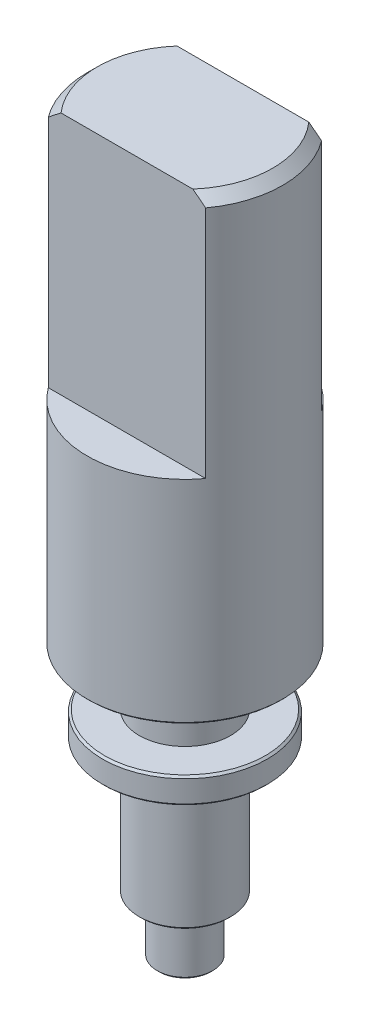
ISO-10303-21;
HEADER;
FILE_DESCRIPTION(('STEP AP214'),'2;1');
FILE_NAME('part.step','',(''),(''),'','','');
FILE_SCHEMA(('AUTOMOTIVE_DESIGN { 1 0 10303 214 1 1 1 1 }'));
ENDSEC;
DATA;
#1=APPLICATION_CONTEXT('core data for automotive mechanical design processes');
#2=APPLICATION_PROTOCOL_DEFINITION('international standard','automotive_design',2000,#1);
#3=PRODUCT_CONTEXT('',#1,'mechanical');
#4=PRODUCT('Part','Part','',(#3));
#5=PRODUCT_RELATED_PRODUCT_CATEGORY('part','',(#4));
#6=PRODUCT_DEFINITION_FORMATION('','',#4);
#7=PRODUCT_DEFINITION_CONTEXT('part definition',#1,'design');
#8=PRODUCT_DEFINITION('design','',#6,#7);
#9=PRODUCT_DEFINITION_SHAPE('','',#8);
#10=(LENGTH_UNIT() NAMED_UNIT(*) SI_UNIT(.MILLI.,.METRE.));
#11=(NAMED_UNIT(*) PLANE_ANGLE_UNIT() SI_UNIT($,.RADIAN.));
#12=(NAMED_UNIT(*) SI_UNIT($,.STERADIAN.) SOLID_ANGLE_UNIT());
#13=UNCERTAINTY_MEASURE_WITH_UNIT(LENGTH_MEASURE(1.E-05),#10,'distance_accuracy_value','');
#14=(GEOMETRIC_REPRESENTATION_CONTEXT(3) GLOBAL_UNCERTAINTY_ASSIGNED_CONTEXT((#13)) GLOBAL_UNIT_ASSIGNED_CONTEXT((#10,
#11,#12)) REPRESENTATION_CONTEXT('',''));
#15=CARTESIAN_POINT('',(0.,0.,0.));
#16=DIRECTION('',(0.,0.,1.));
#17=DIRECTION('',(1.,0.,0.));
#18=AXIS2_PLACEMENT_3D('',#15,#16,#17);
#19=CARTESIAN_POINT('',(-2.46,18.3,0.));
#20=DIRECTION('',(0.,1.,0.));
#21=DIRECTION('',(0.,0.,1.));
#22=AXIS2_PLACEMENT_3D('',#19,#20,#21);
#23=PLANE('',#22);
#24=DIRECTION('',(1.,0.,0.));
#25=VECTOR('',#24,1.);
#26=CARTESIAN_POINT('',(-1.97989898732233,18.3,-1.46));
#27=LINE('',#26,#25);
#28=CARTESIAN_POINT('',(-1.65906600230371,18.3,-1.46));
#29=VERTEX_POINT('',#28);
#30=CARTESIAN_POINT('',(1.65906600230371,18.3,-1.46));
#31=VERTEX_POINT('',#30);
#32=EDGE_CURVE('E96',#29,#31,#27,.T.);
#33=ORIENTED_EDGE('',*,*,#32,.F.);
#34=CARTESIAN_POINT('',(0.,18.3,0.));
#35=DIRECTION('',(0.,1.,0.));
#36=DIRECTION('',(0.,0.,1.));
#37=AXIS2_PLACEMENT_3D('',#34,#35,#36);
#38=CIRCLE('',#37,2.21);
#39=CARTESIAN_POINT('',(-1.65906600230371,18.3,1.46));
#40=VERTEX_POINT('',#39);
#41=EDGE_CURVE('E135',#29,#40,#38,.T.);
#42=ORIENTED_EDGE('',*,*,#41,.T.);
#43=DIRECTION('',(-1.,0.,0.));
#44=VECTOR('',#43,1.);
#45=CARTESIAN_POINT('',(-1.97989898732233,18.3,1.46));
#46=LINE('',#45,#44);
#47=CARTESIAN_POINT('',(1.65906600230371,18.3,1.46));
#48=VERTEX_POINT('',#47);
#49=EDGE_CURVE('E105',#48,#40,#46,.T.);
#50=ORIENTED_EDGE('',*,*,#49,.F.);
#51=CARTESIAN_POINT('',(0.,18.3,0.));
#52=DIRECTION('',(0.,1.,0.));
#53=DIRECTION('',(0.,0.,1.));
#54=AXIS2_PLACEMENT_3D('',#51,#52,#53);
#55=CIRCLE('',#54,2.21);
#56=EDGE_CURVE('E132',#48,#31,#55,.T.);
#57=ORIENTED_EDGE('',*,*,#56,.T.);
#58=EDGE_LOOP('',(#33,#42,#50,#57));
#59=FACE_BOUND('',#58,.T.);
#60=ADVANCED_FACE('F37',(#59),#23,.T.);
#61=CARTESIAN_POINT('',(0.,0.,0.));
#62=DIRECTION('',(0.,-1.,0.));
#63=DIRECTION('',(0.,0.,-1.));
#64=AXIS2_PLACEMENT_3D('',#61,#62,#63);
#65=PLANE('',#64);
#66=CARTESIAN_POINT('',(0.,0.,0.));
#67=DIRECTION('',(0.,-1.,0.));
#68=DIRECTION('',(0.,0.,-1.));
#69=AXIS2_PLACEMENT_3D('',#66,#67,#68);
#70=CIRCLE('',#69,0.649999999999996);
#71=CARTESIAN_POINT('',(0.,0.,-0.649999999999996));
#72=VERTEX_POINT('',#71);
#73=EDGE_CURVE('E11',#72,#72,#70,.T.);
#74=ORIENTED_EDGE('',*,*,#73,.T.);
#75=EDGE_LOOP('',(#74));
#76=FACE_BOUND('',#75,.T.);
#77=ADVANCED_FACE('F197',(#76),#65,.T.);
#78=CARTESIAN_POINT('',(0.,18.3,0.));
#79=DIRECTION('',(0.,1.,0.));
#80=DIRECTION('',(0.,0.,1.));
#81=AXIS2_PLACEMENT_3D('',#78,#79,#80);
#82=CYLINDRICAL_SURFACE('',#81,0.699999999999998);
#83=CARTESIAN_POINT('',(0.,0.0500000000000014,0.));
#84=DIRECTION('',(0.,-1.,0.));
#85=DIRECTION('',(0.,0.,-1.));
#86=AXIS2_PLACEMENT_3D('',#83,#84,#85);
#87=CIRCLE('',#86,0.699999999999998);
#88=CARTESIAN_POINT('',(0.,0.0500000000000014,-0.699999999999998));
#89=VERTEX_POINT('',#88);
#90=EDGE_CURVE('E45',#89,#89,#87,.F.);
#91=ORIENTED_EDGE('',*,*,#90,.T.);
#92=EDGE_LOOP('',(#91));
#93=FACE_BOUND('',#92,.T.);
#94=CARTESIAN_POINT('',(0.,1.4,0.));
#95=DIRECTION('',(0.,1.,0.));
#96=DIRECTION('',(0.,0.,1.));
#97=AXIS2_PLACEMENT_3D('',#94,#95,#96);
#98=CIRCLE('',#97,0.699999999999998);
#99=CARTESIAN_POINT('',(0.,1.4,0.699999999999998));
#100=VERTEX_POINT('',#99);
#101=EDGE_CURVE('E129',#100,#100,#98,.T.);
#102=ORIENTED_EDGE('',*,*,#101,.F.);
#103=EDGE_LOOP('',(#102));
#104=FACE_BOUND('',#103,.T.);
#105=ADVANCED_FACE('F193',(#93,#104),#82,.T.);
#106=CARTESIAN_POINT('',(-0.699999999999998,1.4,0.));
#107=DIRECTION('',(0.,-1.,0.));
#108=DIRECTION('',(0.,0.,-1.));
#109=AXIS2_PLACEMENT_3D('',#106,#107,#108);
#110=PLANE('',#109);
#111=CARTESIAN_POINT('',(0.,1.4,0.));
#112=DIRECTION('',(0.,-1.,0.));
#113=DIRECTION('',(0.,0.,-1.));
#114=AXIS2_PLACEMENT_3D('',#111,#112,#113);
#115=CIRCLE('',#114,1.1);
#116=CARTESIAN_POINT('',(0.,1.4,-1.1));
#117=VERTEX_POINT('',#116);
#118=EDGE_CURVE('E407',#117,#117,#115,.T.);
#119=ORIENTED_EDGE('',*,*,#118,.T.);
#120=EDGE_LOOP('',(#119));
#121=FACE_BOUND('',#120,.T.);
#122=ORIENTED_EDGE('',*,*,#101,.T.);
#123=EDGE_LOOP('',(#122));
#124=FACE_BOUND('',#123,.T.);
#125=ADVANCED_FACE('F189',(#121,#124),#110,.T.);
#126=CARTESIAN_POINT('',(0.,18.3,0.));
#127=DIRECTION('',(0.,1.,0.));
#128=DIRECTION('',(0.,0.,1.));
#129=AXIS2_PLACEMENT_3D('',#126,#127,#128);
#130=CYLINDRICAL_SURFACE('',#129,1.15);
#131=CARTESIAN_POINT('',(0.,1.45,0.));
#132=DIRECTION('',(0.,-1.,0.));
#133=DIRECTION('',(0.,0.,-1.));
#134=AXIS2_PLACEMENT_3D('',#131,#132,#133);
#135=CIRCLE('',#134,1.15);
#136=CARTESIAN_POINT('',(0.,1.45,-1.15));
#137=VERTEX_POINT('',#136);
#138=EDGE_CURVE('E410',#137,#137,#135,.F.);
#139=ORIENTED_EDGE('',*,*,#138,.T.);
#140=EDGE_LOOP('',(#139));
#141=FACE_BOUND('',#140,.T.);
#142=CARTESIAN_POINT('',(0.,4.75,0.));
#143=DIRECTION('',(0.,1.,0.));
#144=DIRECTION('',(0.,0.,1.));
#145=AXIS2_PLACEMENT_3D('',#142,#143,#144);
#146=CIRCLE('',#145,1.15);
#147=CARTESIAN_POINT('',(0.,4.75,1.15));
#148=VERTEX_POINT('',#147);
#149=EDGE_CURVE('E126',#148,#148,#146,.T.);
#150=ORIENTED_EDGE('',*,*,#149,.F.);
#151=EDGE_LOOP('',(#150));
#152=FACE_BOUND('',#151,.T.);
#153=ADVANCED_FACE('F185',(#141,#152),#130,.T.);
#154=CARTESIAN_POINT('',(-1.15,4.75,0.));
#155=DIRECTION('',(0.,-1.,0.));
#156=DIRECTION('',(0.,0.,-1.));
#157=AXIS2_PLACEMENT_3D('',#154,#155,#156);
#158=PLANE('',#157);
#159=CARTESIAN_POINT('',(0.,4.75,0.));
#160=DIRECTION('',(0.,-1.,0.));
#161=DIRECTION('',(0.,0.,-1.));
#162=AXIS2_PLACEMENT_3D('',#159,#160,#161);
#163=CIRCLE('',#162,2.025);
#164=CARTESIAN_POINT('',(0.,4.75,-2.025));
#165=VERTEX_POINT('',#164);
#166=EDGE_CURVE('E394',#165,#165,#163,.T.);
#167=ORIENTED_EDGE('',*,*,#166,.T.);
#168=EDGE_LOOP('',(#167));
#169=FACE_BOUND('',#168,.T.);
#170=ORIENTED_EDGE('',*,*,#149,.T.);
#171=EDGE_LOOP('',(#170));
#172=FACE_BOUND('',#171,.T.);
#173=ADVANCED_FACE('F181',(#169,#172),#158,.T.);
#174=CARTESIAN_POINT('',(0.,18.3,0.));
#175=DIRECTION('',(0.,1.,0.));
#176=DIRECTION('',(0.,0.,1.));
#177=AXIS2_PLACEMENT_3D('',#174,#175,#176);
#178=CYLINDRICAL_SURFACE('',#177,2.075);
#179=CARTESIAN_POINT('',(0.,5.35,0.));
#180=DIRECTION('',(0.,1.,0.));
#181=DIRECTION('',(0.,0.,1.));
#182=AXIS2_PLACEMENT_3D('',#179,#180,#181);
#183=CIRCLE('',#182,2.075);
#184=CARTESIAN_POINT('',(0.,5.35,2.075));
#185=VERTEX_POINT('',#184);
#186=EDGE_CURVE('E396',#185,#185,#183,.F.);
#187=ORIENTED_EDGE('',*,*,#186,.T.);
#188=EDGE_LOOP('',(#187));
#189=FACE_BOUND('',#188,.T.);
#190=CARTESIAN_POINT('',(0.,4.8,0.));
#191=DIRECTION('',(0.,-1.,0.));
#192=DIRECTION('',(0.,0.,-1.));
#193=AXIS2_PLACEMENT_3D('',#190,#191,#192);
#194=CIRCLE('',#193,2.075);
#195=CARTESIAN_POINT('',(0.,4.8,-2.075));
#196=VERTEX_POINT('',#195);
#197=EDGE_CURVE('E401',#196,#196,#194,.F.);
#198=ORIENTED_EDGE('',*,*,#197,.T.);
#199=EDGE_LOOP('',(#198));
#200=FACE_BOUND('',#199,.T.);
#201=ADVANCED_FACE('F177',(#189,#200),#178,.T.);
#202=CARTESIAN_POINT('',(-2.075,5.4,0.));
#203=DIRECTION('',(0.,1.,0.));
#204=DIRECTION('',(0.,0.,1.));
#205=AXIS2_PLACEMENT_3D('',#202,#203,#204);
#206=PLANE('',#205);
#207=CARTESIAN_POINT('',(0.,5.4,0.));
#208=DIRECTION('',(0.,1.,0.));
#209=DIRECTION('',(0.,0.,1.));
#210=AXIS2_PLACEMENT_3D('',#207,#208,#209);
#211=CIRCLE('',#210,2.025);
#212=CARTESIAN_POINT('',(0.,5.4,2.025));
#213=VERTEX_POINT('',#212);
#214=EDGE_CURVE('E404',#213,#213,#211,.T.);
#215=ORIENTED_EDGE('',*,*,#214,.T.);
#216=EDGE_LOOP('',(#215));
#217=FACE_BOUND('',#216,.T.);
#218=CARTESIAN_POINT('',(0.,5.4,0.));
#219=DIRECTION('',(0.,1.,0.));
#220=DIRECTION('',(0.,0.,1.));
#221=AXIS2_PLACEMENT_3D('',#218,#219,#220);
#222=CIRCLE('',#221,1.15);
#223=CARTESIAN_POINT('',(0.,5.4,1.15));
#224=VERTEX_POINT('',#223);
#225=EDGE_CURVE('E123',#224,#224,#222,.T.);
#226=ORIENTED_EDGE('',*,*,#225,.F.);
#227=EDGE_LOOP('',(#226));
#228=FACE_BOUND('',#227,.T.);
#229=ADVANCED_FACE('F173',(#217,#228),#206,.T.);
#230=CARTESIAN_POINT('',(0.,18.3,0.));
#231=DIRECTION('',(0.,1.,0.));
#232=DIRECTION('',(0.,0.,1.));
#233=AXIS2_PLACEMENT_3D('',#230,#231,#232);
#234=CYLINDRICAL_SURFACE('',#233,1.15);
#235=ORIENTED_EDGE('',*,*,#225,.T.);
#236=EDGE_LOOP('',(#235));
#237=FACE_BOUND('',#236,.T.);
#238=CARTESIAN_POINT('',(0.,6.8,0.));
#239=DIRECTION('',(0.,1.,0.));
#240=DIRECTION('',(0.,0.,1.));
#241=AXIS2_PLACEMENT_3D('',#238,#239,#240);
#242=CIRCLE('',#241,1.15);
#243=CARTESIAN_POINT('',(0.,6.8,1.15));
#244=VERTEX_POINT('',#243);
#245=EDGE_CURVE('E118',#244,#244,#242,.T.);
#246=ORIENTED_EDGE('',*,*,#245,.F.);
#247=EDGE_LOOP('',(#246));
#248=FACE_BOUND('',#247,.T.);
#249=ADVANCED_FACE('F169',(#237,#248),#234,.T.);
#250=CARTESIAN_POINT('',(-1.15,6.8,0.));
#251=DIRECTION('',(0.,-1.,0.));
#252=DIRECTION('',(0.,0.,-1.));
#253=AXIS2_PLACEMENT_3D('',#250,#251,#252);
#254=PLANE('',#253);
#255=CARTESIAN_POINT('',(0.,6.8,0.));
#256=DIRECTION('',(0.,-1.,0.));
#257=DIRECTION('',(0.,0.,-1.));
#258=AXIS2_PLACEMENT_3D('',#255,#256,#257);
#259=CIRCLE('',#258,2.40999999999999);
#260=CARTESIAN_POINT('',(0.,6.8,-2.40999999999999));
#261=VERTEX_POINT('',#260);
#262=EDGE_CURVE('E412',#261,#261,#259,.T.);
#263=ORIENTED_EDGE('',*,*,#262,.T.);
#264=EDGE_LOOP('',(#263));
#265=FACE_BOUND('',#264,.T.);
#266=ORIENTED_EDGE('',*,*,#245,.T.);
#267=EDGE_LOOP('',(#266));
#268=FACE_BOUND('',#267,.T.);
#269=ADVANCED_FACE('F165',(#265,#268),#254,.T.);
#270=CARTESIAN_POINT('',(0.,18.3,0.));
#271=DIRECTION('',(0.,1.,0.));
#272=DIRECTION('',(0.,0.,1.));
#273=AXIS2_PLACEMENT_3D('',#270,#271,#272);
#274=CYLINDRICAL_SURFACE('',#273,2.46);
#275=CARTESIAN_POINT('',(0.,6.85,0.));
#276=DIRECTION('',(0.,-1.,0.));
#277=DIRECTION('',(0.,0.,-1.));
#278=AXIS2_PLACEMENT_3D('',#275,#276,#277);
#279=CIRCLE('',#278,2.46);
#280=CARTESIAN_POINT('',(0.,6.85,-2.46));
#281=VERTEX_POINT('',#280);
#282=EDGE_CURVE('E216',#281,#281,#279,.F.);
#283=ORIENTED_EDGE('',*,*,#282,.T.);
#284=EDGE_LOOP('',(#283));
#285=FACE_BOUND('',#284,.T.);
#286=DIRECTION('',(0.,1.,0.));
#287=VECTOR('',#286,1.);
#288=CARTESIAN_POINT('',(-1.97989898732233,12.15,1.46));
#289=LINE('',#288,#287);
#290=CARTESIAN_POINT('',(-1.97989898732233,12.15,1.46));
#291=VERTEX_POINT('',#290);
#292=CARTESIAN_POINT('',(-1.97989898732233,18.05,1.46));
#293=VERTEX_POINT('',#292);
#294=EDGE_CURVE('E116',#291,#293,#289,.T.);
#295=ORIENTED_EDGE('',*,*,#294,.T.);
#296=CARTESIAN_POINT('',(0.,18.05,0.));
#297=DIRECTION('',(0.,1.,0.));
#298=DIRECTION('',(0.,0.,1.));
#299=AXIS2_PLACEMENT_3D('',#296,#297,#298);
#300=CIRCLE('',#299,2.46);
#301=CARTESIAN_POINT('',(-1.97989898732233,18.05,-1.46));
#302=VERTEX_POINT('',#301);
#303=EDGE_CURVE('E52',#293,#302,#300,.F.);
#304=ORIENTED_EDGE('',*,*,#303,.T.);
#305=DIRECTION('',(0.,1.,0.));
#306=VECTOR('',#305,1.);
#307=CARTESIAN_POINT('',(-1.97989898732233,12.15,-1.46));
#308=LINE('',#307,#306);
#309=CARTESIAN_POINT('',(-1.97989898732233,12.15,-1.46));
#310=VERTEX_POINT('',#309);
#311=EDGE_CURVE('E99',#310,#302,#308,.T.);
#312=ORIENTED_EDGE('',*,*,#311,.F.);
#313=CARTESIAN_POINT('',(0.,12.15,0.));
#314=DIRECTION('',(0.,1.,0.));
#315=DIRECTION('',(0.,0.,1.));
#316=AXIS2_PLACEMENT_3D('',#313,#314,#315);
#317=CIRCLE('',#316,2.46);
#318=CARTESIAN_POINT('',(1.97989898732233,12.15,-1.46));
#319=VERTEX_POINT('',#318);
#320=EDGE_CURVE('E92',#319,#310,#317,.T.);
#321=ORIENTED_EDGE('',*,*,#320,.F.);
#322=DIRECTION('',(0.,1.,0.));
#323=VECTOR('',#322,1.);
#324=CARTESIAN_POINT('',(1.97989898732233,12.15,-1.46));
#325=LINE('',#324,#323);
#326=CARTESIAN_POINT('',(1.97989898732233,18.05,-1.46));
#327=VERTEX_POINT('',#326);
#328=EDGE_CURVE('E101',#319,#327,#325,.T.);
#329=ORIENTED_EDGE('',*,*,#328,.T.);
#330=CARTESIAN_POINT('',(0.,18.05,0.));
#331=DIRECTION('',(0.,1.,0.));
#332=DIRECTION('',(0.,0.,1.));
#333=AXIS2_PLACEMENT_3D('',#330,#331,#332);
#334=CIRCLE('',#333,2.46);
#335=CARTESIAN_POINT('',(1.97989898732233,18.05,1.46));
#336=VERTEX_POINT('',#335);
#337=EDGE_CURVE('E385',#327,#336,#334,.F.);
#338=ORIENTED_EDGE('',*,*,#337,.T.);
#339=DIRECTION('',(0.,1.,0.));
#340=VECTOR('',#339,1.);
#341=CARTESIAN_POINT('',(1.97989898732233,12.15,1.46));
#342=LINE('',#341,#340);
#343=CARTESIAN_POINT('',(1.97989898732233,12.15,1.46));
#344=VERTEX_POINT('',#343);
#345=EDGE_CURVE('E113',#344,#336,#342,.T.);
#346=ORIENTED_EDGE('',*,*,#345,.F.);
#347=CARTESIAN_POINT('',(0.,12.15,0.));
#348=DIRECTION('',(0.,1.,0.));
#349=DIRECTION('',(0.,0.,1.));
#350=AXIS2_PLACEMENT_3D('',#347,#348,#349);
#351=CIRCLE('',#350,2.46);
#352=EDGE_CURVE('E109',#291,#344,#351,.T.);
#353=ORIENTED_EDGE('',*,*,#352,.F.);
#354=EDGE_LOOP('',(#295,#304,#312,#321,#329,#338,#346,#353));
#355=FACE_BOUND('',#354,.T.);
#356=ADVANCED_FACE('F103',(#285,#355),#274,.T.);
#357=CARTESIAN_POINT('',(-1.97989898732233,12.15,1.46));
#358=DIRECTION('',(0.,0.,-1.));
#359=DIRECTION('',(-1.,0.,0.));
#360=AXIS2_PLACEMENT_3D('',#357,#358,#359);
#361=PLANE('',#360);
#362=ORIENTED_EDGE('',*,*,#49,.T.);
#363=CARTESIAN_POINT('',(-1.65906600230371,18.3,1.46));
#364=CARTESIAN_POINT('',(-1.68617458978429,18.2796484395284,1.46));
#365=CARTESIAN_POINT('',(-1.71317928404995,18.2591590177984,1.46));
#366=CARTESIAN_POINT('',(-1.76699585580801,18.217932332114,1.46));
#367=CARTESIAN_POINT('',(-1.79380774678302,18.1971950857651,1.46));
#368=CARTESIAN_POINT('',(-1.84725720985176,18.1554979799921,1.46));
#369=CARTESIAN_POINT('',(-1.87389478387278,18.134538123036,1.46));
#370=CARTESIAN_POINT('',(-1.92701213315352,18.0924155188503,1.46));
#371=CARTESIAN_POINT('',(-1.95349189714086,18.0712527574024,1.46));
#372=CARTESIAN_POINT('',(-1.97989898732235,18.05,1.46));
#373=B_SPLINE_CURVE_WITH_KNOTS('',3,(#363,#364,#365,#366,#367,#368,#369,#370,#371,#372),
.UNSPECIFIED.,.F.,.F.,(4,2,2,2,4),(0.,0.101692536253413,0.203377890674927,0.305062118932271,
0.406753525481858),.UNSPECIFIED.);
#374=EDGE_CURVE('E145',#40,#293,#373,.T.);
#375=ORIENTED_EDGE('',*,*,#374,.T.);
#376=ORIENTED_EDGE('',*,*,#294,.F.);
#377=DIRECTION('',(-1.,0.,0.));
#378=VECTOR('',#377,1.);
#379=CARTESIAN_POINT('',(-1.97989898732233,12.15,1.46));
#380=LINE('',#379,#378);
#381=EDGE_CURVE('E111',#344,#291,#380,.T.);
#382=ORIENTED_EDGE('',*,*,#381,.F.);
#383=ORIENTED_EDGE('',*,*,#345,.T.);
#384=CARTESIAN_POINT('',(1.97989898732233,18.05,1.46));
#385=CARTESIAN_POINT('',(1.95349189714085,18.0712527574024,1.46));
#386=CARTESIAN_POINT('',(1.92701213315352,18.0924155188503,1.46));
#387=CARTESIAN_POINT('',(1.87389478387278,18.134538123036,1.46));
#388=CARTESIAN_POINT('',(1.84725720985176,18.1554979799921,1.46));
#389=CARTESIAN_POINT('',(1.79380774678302,18.1971950857651,1.46));
#390=CARTESIAN_POINT('',(1.76699585580801,18.2179323321139,1.46));
#391=CARTESIAN_POINT('',(1.71317928404995,18.2591590177984,1.46));
#392=CARTESIAN_POINT('',(1.6861745897843,18.2796484395284,1.46));
#393=CARTESIAN_POINT('',(1.65906600230374,18.3,1.46));
#394=B_SPLINE_CURVE_WITH_KNOTS('',3,(#384,#385,#386,#387,#388,#389,#390,#391,#392,#393),
.UNSPECIFIED.,.F.,.F.,(4,2,2,2,4),(0.,0.101691406549585,0.203375634806927,0.305060989228441,
0.406753525481854),.UNSPECIFIED.);
#395=EDGE_CURVE('E138',#336,#48,#394,.T.);
#396=ORIENTED_EDGE('',*,*,#395,.T.);
#397=EDGE_LOOP('',(#362,#375,#376,#382,#383,#396));
#398=FACE_BOUND('',#397,.T.);
#399=ADVANCED_FACE('F154',(#398),#361,.F.);
#400=CARTESIAN_POINT('',(0.,12.15,0.));
#401=DIRECTION('',(0.,1.,0.));
#402=DIRECTION('',(0.,0.,1.));
#403=AXIS2_PLACEMENT_3D('',#400,#401,#402);
#404=PLANE('',#403);
#405=ORIENTED_EDGE('',*,*,#352,.T.);
#406=ORIENTED_EDGE('',*,*,#381,.T.);
#407=EDGE_LOOP('',(#405,#406));
#408=FACE_BOUND('',#407,.T.);
#409=ADVANCED_FACE('F159',(#408),#404,.T.);
#410=CARTESIAN_POINT('',(-1.97989898732233,12.15,-1.46));
#411=DIRECTION('',(0.,0.,1.));
#412=DIRECTION('',(1.,0.,0.));
#413=AXIS2_PLACEMENT_3D('',#410,#411,#412);
#414=PLANE('',#413);
#415=ORIENTED_EDGE('',*,*,#311,.T.);
#416=CARTESIAN_POINT('',(-1.97989898732233,18.05,-1.46));
#417=CARTESIAN_POINT('',(-1.95349189714085,18.0712527574024,-1.46));
#418=CARTESIAN_POINT('',(-1.92701213315352,18.0924155188503,-1.46));
#419=CARTESIAN_POINT('',(-1.87389478387278,18.134538123036,-1.46));
#420=CARTESIAN_POINT('',(-1.84725720985176,18.1554979799921,-1.46));
#421=CARTESIAN_POINT('',(-1.79380774678302,18.1971950857651,-1.46));
#422=CARTESIAN_POINT('',(-1.76699585580801,18.2179323321139,-1.46));
#423=CARTESIAN_POINT('',(-1.71317928404996,18.2591590177984,-1.46));
#424=CARTESIAN_POINT('',(-1.6861745897843,18.2796484395284,-1.46));
#425=CARTESIAN_POINT('',(-1.65906600230374,18.3,-1.46));
#426=B_SPLINE_CURVE_WITH_KNOTS('',3,(#416,#417,#418,#419,#420,#421,#422,#423,#424,#425),
.UNSPECIFIED.,.F.,.F.,(4,2,2,2,4),(0.,0.101691406549585,0.203375634806927,0.305060989228437,
0.406753525481854),.UNSPECIFIED.);
#427=EDGE_CURVE('E210',#302,#29,#426,.T.);
#428=ORIENTED_EDGE('',*,*,#427,.T.);
#429=ORIENTED_EDGE('',*,*,#32,.T.);
#430=CARTESIAN_POINT('',(1.65906600230371,18.3,-1.46));
#431=CARTESIAN_POINT('',(1.68617458978429,18.2796484395284,-1.46));
#432=CARTESIAN_POINT('',(1.71317928404995,18.2591590177984,-1.46));
#433=CARTESIAN_POINT('',(1.76699585580801,18.217932332114,-1.46));
#434=CARTESIAN_POINT('',(1.79380774678302,18.1971950857651,-1.46));
#435=CARTESIAN_POINT('',(1.84725720985176,18.1554979799921,-1.46));
#436=CARTESIAN_POINT('',(1.87389478387278,18.134538123036,-1.46));
#437=CARTESIAN_POINT('',(1.92701213315352,18.0924155188503,-1.46));
#438=CARTESIAN_POINT('',(1.95349189714086,18.0712527574024,-1.46));
#439=CARTESIAN_POINT('',(1.97989898732235,18.05,-1.46));
#440=B_SPLINE_CURVE_WITH_KNOTS('',3,(#430,#431,#432,#433,#434,#435,#436,#437,#438,#439),
.UNSPECIFIED.,.F.,.F.,(4,2,2,2,4),(0.,0.101692536253413,0.203377890674927,0.305062118932271,
0.406753525481858),.UNSPECIFIED.);
#441=EDGE_CURVE('E60',#31,#327,#440,.T.);
#442=ORIENTED_EDGE('',*,*,#441,.T.);
#443=ORIENTED_EDGE('',*,*,#328,.F.);
#444=DIRECTION('',(1.,0.,0.));
#445=VECTOR('',#444,1.);
#446=CARTESIAN_POINT('',(-1.97989898732233,12.15,-1.46));
#447=LINE('',#446,#445);
#448=EDGE_CURVE('E95',#310,#319,#447,.T.);
#449=ORIENTED_EDGE('',*,*,#448,.F.);
#450=EDGE_LOOP('',(#415,#428,#429,#442,#443,#449));
#451=FACE_BOUND('',#450,.T.);
#452=ADVANCED_FACE('F98',(#451),#414,.F.);
#453=CARTESIAN_POINT('',(0.,12.15,0.));
#454=DIRECTION('',(0.,1.,0.));
#455=DIRECTION('',(0.,0.,1.));
#456=AXIS2_PLACEMENT_3D('',#453,#454,#455);
#457=PLANE('',#456);
#458=ORIENTED_EDGE('',*,*,#320,.T.);
#459=ORIENTED_EDGE('',*,*,#448,.T.);
#460=EDGE_LOOP('',(#458,#459));
#461=FACE_BOUND('',#460,.T.);
#462=ADVANCED_FACE('F94',(#461),#457,.T.);
#463=CARTESIAN_POINT('',(0.,18.3,0.));
#464=DIRECTION('',(0.,-1.,0.));
#465=DIRECTION('',(0.,0.,-1.));
#466=AXIS2_PLACEMENT_3D('',#463,#464,#465);
#467=CONICAL_SURFACE('',#466,2.21,0.785398163397447);
#468=ORIENTED_EDGE('',*,*,#427,.F.);
#469=ORIENTED_EDGE('',*,*,#303,.F.);
#470=ORIENTED_EDGE('',*,*,#374,.F.);
#471=ORIENTED_EDGE('',*,*,#41,.F.);
#472=EDGE_LOOP('',(#468,#469,#470,#471));
#473=FACE_BOUND('',#472,.T.);
#474=ADVANCED_FACE('F204',(#473),#467,.T.);
#475=CARTESIAN_POINT('',(0.,18.3,0.));
#476=DIRECTION('',(0.,-1.,0.));
#477=DIRECTION('',(0.,0.,-1.));
#478=AXIS2_PLACEMENT_3D('',#475,#476,#477);
#479=CONICAL_SURFACE('',#478,2.21,0.785398163397447);
#480=ORIENTED_EDGE('',*,*,#395,.F.);
#481=ORIENTED_EDGE('',*,*,#337,.F.);
#482=ORIENTED_EDGE('',*,*,#441,.F.);
#483=ORIENTED_EDGE('',*,*,#56,.F.);
#484=EDGE_LOOP('',(#480,#481,#482,#483));
#485=FACE_BOUND('',#484,.T.);
#486=ADVANCED_FACE('F151',(#485),#479,.T.);
#487=CARTESIAN_POINT('',(0.,6.85,0.));
#488=DIRECTION('',(0.,1.,0.));
#489=DIRECTION('',(0.,0.,1.));
#490=AXIS2_PLACEMENT_3D('',#487,#488,#489);
#491=CONICAL_SURFACE('',#490,2.46,0.785398163397461);
#492=ORIENTED_EDGE('',*,*,#262,.F.);
#493=EDGE_LOOP('',(#492));
#494=FACE_BOUND('',#493,.T.);
#495=ORIENTED_EDGE('',*,*,#282,.F.);
#496=EDGE_LOOP('',(#495));
#497=FACE_BOUND('',#496,.T.);
#498=ADVANCED_FACE('F244',(#494,#497),#491,.T.);
#499=CARTESIAN_POINT('',(0.,1.45,0.));
#500=DIRECTION('',(0.,1.,0.));
#501=DIRECTION('',(0.,0.,1.));
#502=AXIS2_PLACEMENT_3D('',#499,#500,#501);
#503=CONICAL_SURFACE('',#502,1.15,0.785398163397409);
#504=ORIENTED_EDGE('',*,*,#118,.F.);
#505=EDGE_LOOP('',(#504));
#506=FACE_BOUND('',#505,.T.);
#507=ORIENTED_EDGE('',*,*,#138,.F.);
#508=EDGE_LOOP('',(#507));
#509=FACE_BOUND('',#508,.T.);
#510=ADVANCED_FACE('F252',(#506,#509),#503,.T.);
#511=CARTESIAN_POINT('',(0.,5.4,0.));
#512=DIRECTION('',(0.,-1.,0.));
#513=DIRECTION('',(0.,0.,-1.));
#514=AXIS2_PLACEMENT_3D('',#511,#512,#513);
#515=CONICAL_SURFACE('',#514,2.025,0.78539816339744);
#516=ORIENTED_EDGE('',*,*,#186,.F.);
#517=EDGE_LOOP('',(#516));
#518=FACE_BOUND('',#517,.T.);
#519=ORIENTED_EDGE('',*,*,#214,.F.);
#520=EDGE_LOOP('',(#519));
#521=FACE_BOUND('',#520,.T.);
#522=ADVANCED_FACE('F260',(#518,#521),#515,.T.);
#523=CARTESIAN_POINT('',(0.,4.8,0.));
#524=DIRECTION('',(0.,1.,0.));
#525=DIRECTION('',(0.,0.,1.));
#526=AXIS2_PLACEMENT_3D('',#523,#524,#525);
#527=CONICAL_SURFACE('',#526,2.075,0.785398163397457);
#528=ORIENTED_EDGE('',*,*,#166,.F.);
#529=EDGE_LOOP('',(#528));
#530=FACE_BOUND('',#529,.T.);
#531=ORIENTED_EDGE('',*,*,#197,.F.);
#532=EDGE_LOOP('',(#531));
#533=FACE_BOUND('',#532,.T.);
#534=ADVANCED_FACE('F268',(#530,#533),#527,.T.);
#535=CARTESIAN_POINT('',(0.,0.0500000000000014,0.));
#536=DIRECTION('',(0.,1.,0.));
#537=DIRECTION('',(0.,0.,1.));
#538=AXIS2_PLACEMENT_3D('',#535,#536,#537);
#539=CONICAL_SURFACE('',#538,0.699999999999998,0.78539816339745);
#540=ORIENTED_EDGE('',*,*,#73,.F.);
#541=EDGE_LOOP('',(#540));
#542=FACE_BOUND('',#541,.T.);
#543=ORIENTED_EDGE('',*,*,#90,.F.);
#544=EDGE_LOOP('',(#543));
#545=FACE_BOUND('',#544,.T.);
#546=ADVANCED_FACE('F39',(#542,#545),#539,.T.);
#547=CLOSED_SHELL('',(#60,#77,#105,#125,#153,#173,#201,#229,#249,#269,#356,#399,#409,#452,#462,
#474,#486,#498,#510,#522,#534,#546));
#548=MANIFOLD_SOLID_BREP('B2',#547);
#549=ADVANCED_BREP_SHAPE_REPRESENTATION('',(#18,#548),#14);
#550=SHAPE_DEFINITION_REPRESENTATION(#9,#549);
ENDSEC;
END-ISO-10303-21;
